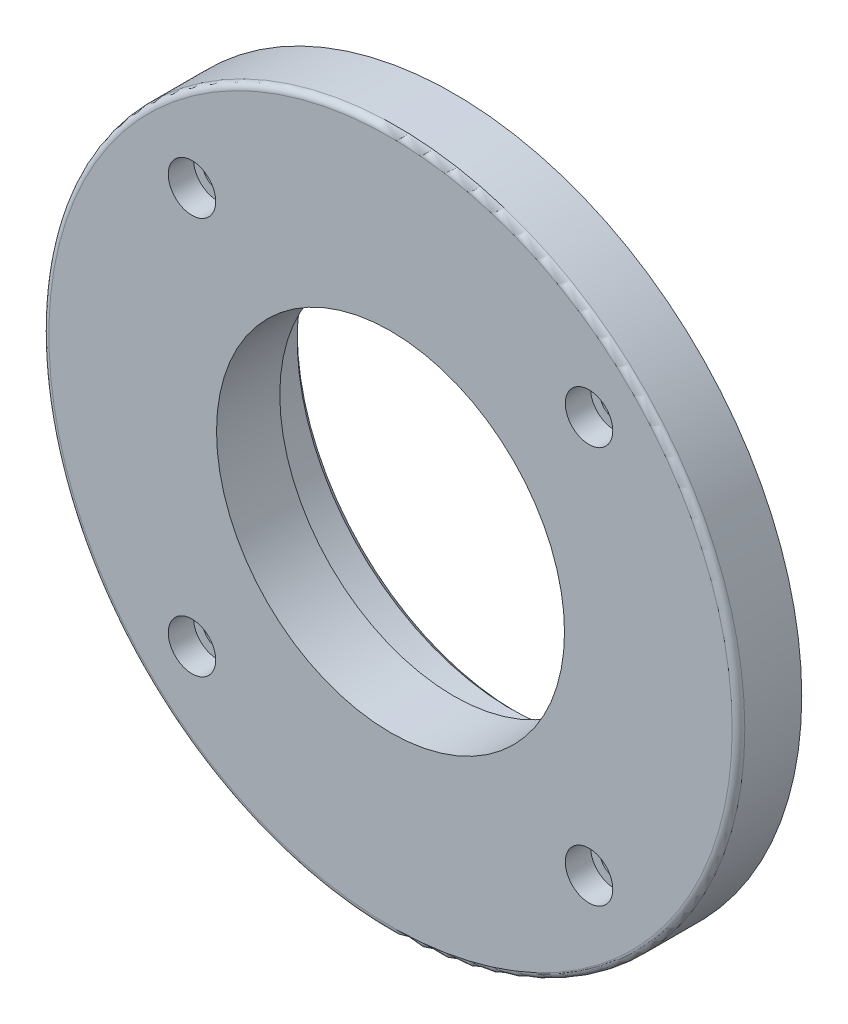
ISO-10303-21;
HEADER;
FILE_DESCRIPTION(('STEP AP214'),'2;1');
FILE_NAME('part.step','',(''),(''),'','','');
FILE_SCHEMA(('AUTOMOTIVE_DESIGN { 1 0 10303 214 1 1 1 1 }'));
ENDSEC;
DATA;
#1=APPLICATION_CONTEXT('core data for automotive mechanical design processes');
#2=APPLICATION_PROTOCOL_DEFINITION('international standard','automotive_design',2000,#1);
#3=PRODUCT_CONTEXT('',#1,'mechanical');
#4=PRODUCT('Part','Part','',(#3));
#5=PRODUCT_RELATED_PRODUCT_CATEGORY('part','',(#4));
#6=PRODUCT_DEFINITION_FORMATION('','',#4);
#7=PRODUCT_DEFINITION_CONTEXT('part definition',#1,'design');
#8=PRODUCT_DEFINITION('design','',#6,#7);
#9=PRODUCT_DEFINITION_SHAPE('','',#8);
#10=(LENGTH_UNIT() NAMED_UNIT(*) SI_UNIT(.MILLI.,.METRE.));
#11=(NAMED_UNIT(*) PLANE_ANGLE_UNIT() SI_UNIT($,.RADIAN.));
#12=(NAMED_UNIT(*) SI_UNIT($,.STERADIAN.) SOLID_ANGLE_UNIT());
#13=UNCERTAINTY_MEASURE_WITH_UNIT(LENGTH_MEASURE(1.E-05),#10,'distance_accuracy_value','');
#14=(GEOMETRIC_REPRESENTATION_CONTEXT(3) GLOBAL_UNCERTAINTY_ASSIGNED_CONTEXT((#13)) GLOBAL_UNIT_ASSIGNED_CONTEXT((#10,
#11,#12)) REPRESENTATION_CONTEXT('',''));
#15=CARTESIAN_POINT('',(0.,0.,0.));
#16=DIRECTION('',(0.,0.,1.));
#17=DIRECTION('',(1.,0.,0.));
#18=AXIS2_PLACEMENT_3D('',#15,#16,#17);
#19=CARTESIAN_POINT('',(0.,0.,0.));
#20=DIRECTION('',(0.,0.,1.));
#21=DIRECTION('',(1.,0.,0.));
#22=AXIS2_PLACEMENT_3D('',#19,#20,#21);
#23=PLANE('',#22);
#24=CARTESIAN_POINT('',(62.7557268303058,62.7557268303064,0.));
#25=DIRECTION('',(0.,0.,1.));
#26=DIRECTION('',(1.,0.,0.));
#27=AXIS2_PLACEMENT_3D('',#24,#25,#26);
#28=CIRCLE('',#27,4.5);
#29=CARTESIAN_POINT('',(67.2557268303058,62.7557268303064,0.));
#30=VERTEX_POINT('',#29);
#31=EDGE_CURVE('E39',#30,#30,#28,.T.);
#32=ORIENTED_EDGE('',*,*,#31,.T.);
#33=EDGE_LOOP('',(#32));
#34=FACE_BOUND('',#33,.T.);
#35=CARTESIAN_POINT('',(62.7557268303058,-62.7557268303064,0.));
#36=DIRECTION('',(0.,0.,1.));
#37=DIRECTION('',(1.,0.,0.));
#38=AXIS2_PLACEMENT_3D('',#35,#36,#37);
#39=CIRCLE('',#38,4.5);
#40=CARTESIAN_POINT('',(67.2557268303058,-62.7557268303064,0.));
#41=VERTEX_POINT('',#40);
#42=EDGE_CURVE('E61',#41,#41,#39,.T.);
#43=ORIENTED_EDGE('',*,*,#42,.T.);
#44=EDGE_LOOP('',(#43));
#45=FACE_BOUND('',#44,.T.);
#46=CARTESIAN_POINT('',(-62.7557268303062,-62.755726830306,0.));
#47=DIRECTION('',(0.,0.,1.));
#48=DIRECTION('',(1.,0.,0.));
#49=AXIS2_PLACEMENT_3D('',#46,#47,#48);
#50=CIRCLE('',#49,4.5);
#51=CARTESIAN_POINT('',(-58.2557268303062,-62.755726830306,0.));
#52=VERTEX_POINT('',#51);
#53=EDGE_CURVE('E57',#52,#52,#50,.T.);
#54=ORIENTED_EDGE('',*,*,#53,.T.);
#55=EDGE_LOOP('',(#54));
#56=FACE_BOUND('',#55,.T.);
#57=CARTESIAN_POINT('',(-62.7557268303058,62.7557268303064,0.));
#58=DIRECTION('',(0.,0.,1.));
#59=DIRECTION('',(1.,0.,0.));
#60=AXIS2_PLACEMENT_3D('',#57,#58,#59);
#61=CIRCLE('',#60,4.5);
#62=CARTESIAN_POINT('',(-58.2557268303058,62.7557268303064,0.));
#63=VERTEX_POINT('',#62);
#64=EDGE_CURVE('E52',#63,#63,#61,.T.);
#65=ORIENTED_EDGE('',*,*,#64,.T.);
#66=EDGE_LOOP('',(#65));
#67=FACE_BOUND('',#66,.T.);
#68=CARTESIAN_POINT('',(0.,0.,0.));
#69=DIRECTION('',(0.,0.,1.));
#70=DIRECTION('',(1.,0.,0.));
#71=AXIS2_PLACEMENT_3D('',#68,#69,#70);
#72=CIRCLE('',#71,110.);
#73=CARTESIAN_POINT('',(110.,0.,0.));
#74=VERTEX_POINT('',#73);
#75=EDGE_CURVE('E97',#74,#74,#72,.T.);
#76=ORIENTED_EDGE('',*,*,#75,.F.);
#77=EDGE_LOOP('',(#76));
#78=FACE_BOUND('',#77,.T.);
#79=CARTESIAN_POINT('',(0.,0.,0.));
#80=DIRECTION('',(0.,0.,1.));
#81=DIRECTION('',(1.,0.,0.));
#82=AXIS2_PLACEMENT_3D('',#79,#80,#81);
#83=CIRCLE('',#82,78.75);
#84=CARTESIAN_POINT('',(78.75,0.,0.));
#85=VERTEX_POINT('',#84);
#86=EDGE_CURVE('E105',#85,#85,#83,.F.);
#87=ORIENTED_EDGE('',*,*,#86,.F.);
#88=EDGE_LOOP('',(#87));
#89=FACE_BOUND('',#88,.T.);
#90=ADVANCED_FACE('F35',(#34,#45,#56,#67,#78,#89),#23,.F.);
#91=CARTESIAN_POINT('',(0.,0.,0.));
#92=DIRECTION('',(0.,0.,1.));
#93=DIRECTION('',(1.,0.,0.));
#94=AXIS2_PLACEMENT_3D('',#91,#92,#93);
#95=CIRCLE('',#94,55.);
#96=CARTESIAN_POINT('',(55.,0.,0.));
#97=VERTEX_POINT('',#96);
#98=EDGE_CURVE('E93',#97,#97,#95,.T.);
#99=ORIENTED_EDGE('',*,*,#98,.T.);
#100=EDGE_LOOP('',(#99));
#101=FACE_BOUND('',#100,.T.);
#102=CARTESIAN_POINT('',(0.,0.,0.));
#103=DIRECTION('',(0.,0.,1.));
#104=DIRECTION('',(1.,0.,0.));
#105=AXIS2_PLACEMENT_3D('',#102,#103,#104);
#106=CIRCLE('',#105,67.5);
#107=CARTESIAN_POINT('',(67.5,0.,0.));
#108=VERTEX_POINT('',#107);
#109=EDGE_CURVE('E102',#108,#108,#106,.T.);
#110=ORIENTED_EDGE('',*,*,#109,.F.);
#111=EDGE_LOOP('',(#110));
#112=FACE_BOUND('',#111,.T.);
#113=ADVANCED_FACE('F125',(#101,#112),#23,.F.);
#114=CARTESIAN_POINT('',(0.,0.,20.));
#115=DIRECTION('',(0.,0.,1.));
#116=DIRECTION('',(1.,0.,0.));
#117=AXIS2_PLACEMENT_3D('',#114,#115,#116);
#118=PLANE('',#117);
#119=CARTESIAN_POINT('',(62.7557268303058,62.7557268303064,20.));
#120=DIRECTION('',(0.,0.,1.));
#121=DIRECTION('',(1.,0.,0.));
#122=AXIS2_PLACEMENT_3D('',#119,#120,#121);
#123=CIRCLE('',#122,7.49999999999999);
#124=CARTESIAN_POINT('',(70.2557268303058,62.7557268303064,20.));
#125=VERTEX_POINT('',#124);
#126=EDGE_CURVE('E331',#125,#125,#123,.T.);
#127=ORIENTED_EDGE('',*,*,#126,.F.);
#128=EDGE_LOOP('',(#127));
#129=FACE_BOUND('',#128,.T.);
#130=CARTESIAN_POINT('',(62.7557268303058,-62.7557268303064,20.));
#131=DIRECTION('',(0.,0.,1.));
#132=DIRECTION('',(1.,0.,0.));
#133=AXIS2_PLACEMENT_3D('',#130,#131,#132);
#134=CIRCLE('',#133,7.49999999999999);
#135=CARTESIAN_POINT('',(70.2557268303058,-62.7557268303064,20.));
#136=VERTEX_POINT('',#135);
#137=EDGE_CURVE('E76',#136,#136,#134,.T.);
#138=ORIENTED_EDGE('',*,*,#137,.F.);
#139=EDGE_LOOP('',(#138));
#140=FACE_BOUND('',#139,.T.);
#141=CARTESIAN_POINT('',(-62.7557268303062,-62.755726830306,20.));
#142=DIRECTION('',(0.,0.,1.));
#143=DIRECTION('',(1.,0.,0.));
#144=AXIS2_PLACEMENT_3D('',#141,#142,#143);
#145=CIRCLE('',#144,7.49999999999999);
#146=CARTESIAN_POINT('',(-55.2557268303062,-62.755726830306,20.));
#147=VERTEX_POINT('',#146);
#148=EDGE_CURVE('E63',#147,#147,#145,.T.);
#149=ORIENTED_EDGE('',*,*,#148,.F.);
#150=EDGE_LOOP('',(#149));
#151=FACE_BOUND('',#150,.T.);
#152=CARTESIAN_POINT('',(-62.7557268303058,62.7557268303064,20.));
#153=DIRECTION('',(0.,0.,1.));
#154=DIRECTION('',(1.,0.,0.));
#155=AXIS2_PLACEMENT_3D('',#152,#153,#154);
#156=CIRCLE('',#155,7.49999999999999);
#157=CARTESIAN_POINT('',(-55.2557268303058,62.7557268303064,20.));
#158=VERTEX_POINT('',#157);
#159=EDGE_CURVE('E59',#158,#158,#156,.T.);
#160=ORIENTED_EDGE('',*,*,#159,.F.);
#161=EDGE_LOOP('',(#160));
#162=FACE_BOUND('',#161,.T.);
#163=CARTESIAN_POINT('',(0.,0.,20.));
#164=DIRECTION('',(0.,0.,1.));
#165=DIRECTION('',(1.,0.,0.));
#166=AXIS2_PLACEMENT_3D('',#163,#164,#165);
#167=CIRCLE('',#166,108.);
#168=CARTESIAN_POINT('',(108.,0.,20.));
#169=VERTEX_POINT('',#168);
#170=EDGE_CURVE('E108',#169,#169,#167,.T.);
#171=ORIENTED_EDGE('',*,*,#170,.T.);
#172=EDGE_LOOP('',(#171));
#173=FACE_BOUND('',#172,.T.);
#174=CARTESIAN_POINT('',(0.,0.,20.));
#175=DIRECTION('',(0.,0.,1.));
#176=DIRECTION('',(1.,0.,0.));
#177=AXIS2_PLACEMENT_3D('',#174,#175,#176);
#178=CIRCLE('',#177,55.);
#179=CARTESIAN_POINT('',(55.,0.,20.));
#180=VERTEX_POINT('',#179);
#181=EDGE_CURVE('E94',#180,#180,#178,.T.);
#182=ORIENTED_EDGE('',*,*,#181,.F.);
#183=EDGE_LOOP('',(#182));
#184=FACE_BOUND('',#183,.T.);
#185=ADVANCED_FACE('F122',(#129,#140,#151,#162,#173,#184),#118,.T.);
#186=CARTESIAN_POINT('',(0.,0.,20.));
#187=DIRECTION('',(0.,0.,-1.));
#188=DIRECTION('',(-1.,0.,0.));
#189=AXIS2_PLACEMENT_3D('',#186,#187,#188);
#190=CYLINDRICAL_SURFACE('',#189,110.);
#191=CARTESIAN_POINT('',(0.,0.,18.));
#192=DIRECTION('',(0.,0.,1.));
#193=DIRECTION('',(1.,0.,0.));
#194=AXIS2_PLACEMENT_3D('',#191,#192,#193);
#195=CIRCLE('',#194,110.);
#196=CARTESIAN_POINT('',(110.,0.,18.));
#197=VERTEX_POINT('',#196);
#198=EDGE_CURVE('E48',#197,#197,#195,.F.);
#199=ORIENTED_EDGE('',*,*,#198,.T.);
#200=EDGE_LOOP('',(#199));
#201=FACE_BOUND('',#200,.T.);
#202=ORIENTED_EDGE('',*,*,#75,.T.);
#203=EDGE_LOOP('',(#202));
#204=FACE_BOUND('',#203,.T.);
#205=ADVANCED_FACE('F113',(#201,#204),#190,.T.);
#206=CARTESIAN_POINT('',(0.,0.,20.));
#207=DIRECTION('',(0.,0.,-1.));
#208=DIRECTION('',(-1.,0.,0.));
#209=AXIS2_PLACEMENT_3D('',#206,#207,#208);
#210=CYLINDRICAL_SURFACE('',#209,55.);
#211=ORIENTED_EDGE('',*,*,#181,.T.);
#212=EDGE_LOOP('',(#211));
#213=FACE_BOUND('',#212,.T.);
#214=ORIENTED_EDGE('',*,*,#98,.F.);
#215=EDGE_LOOP('',(#214));
#216=FACE_BOUND('',#215,.T.);
#217=ADVANCED_FACE('F130',(#213,#216),#210,.F.);
#218=CARTESIAN_POINT('',(0.,0.,0.));
#219=DIRECTION('',(0.,0.,1.));
#220=DIRECTION('',(1.,0.,0.));
#221=AXIS2_PLACEMENT_3D('',#218,#219,#220);
#222=CYLINDRICAL_SURFACE('',#221,78.75);
#223=ORIENTED_EDGE('',*,*,#86,.T.);
#224=EDGE_LOOP('',(#223));
#225=FACE_BOUND('',#224,.T.);
#226=CARTESIAN_POINT('',(0.,0.,-20.));
#227=DIRECTION('',(0.,0.,1.));
#228=DIRECTION('',(1.,0.,0.));
#229=AXIS2_PLACEMENT_3D('',#226,#227,#228);
#230=CIRCLE('',#229,78.75);
#231=CARTESIAN_POINT('',(78.75,0.,-20.));
#232=VERTEX_POINT('',#231);
#233=EDGE_CURVE('E55',#232,#232,#230,.T.);
#234=ORIENTED_EDGE('',*,*,#233,.T.);
#235=EDGE_LOOP('',(#234));
#236=FACE_BOUND('',#235,.T.);
#237=ADVANCED_FACE('F133',(#225,#236),#222,.T.);
#238=CARTESIAN_POINT('',(0.,78.75,-20.));
#239=DIRECTION('',(0.,0.,1.));
#240=DIRECTION('',(1.,0.,0.));
#241=AXIS2_PLACEMENT_3D('',#238,#239,#240);
#242=PLANE('',#241);
#243=CARTESIAN_POINT('',(0.,0.,-20.));
#244=DIRECTION('',(0.,0.,1.));
#245=DIRECTION('',(1.,0.,0.));
#246=AXIS2_PLACEMENT_3D('',#243,#244,#245);
#247=CIRCLE('',#246,69.5);
#248=CARTESIAN_POINT('',(69.5,0.,-20.));
#249=VERTEX_POINT('',#248);
#250=EDGE_CURVE('E43',#249,#249,#247,.T.);
#251=ORIENTED_EDGE('',*,*,#250,.T.);
#252=EDGE_LOOP('',(#251));
#253=FACE_BOUND('',#252,.T.);
#254=ORIENTED_EDGE('',*,*,#233,.F.);
#255=EDGE_LOOP('',(#254));
#256=FACE_BOUND('',#255,.T.);
#257=ADVANCED_FACE('F143',(#253,#256),#242,.F.);
#258=CARTESIAN_POINT('',(0.,0.,0.));
#259=DIRECTION('',(0.,0.,1.));
#260=DIRECTION('',(1.,0.,0.));
#261=AXIS2_PLACEMENT_3D('',#258,#259,#260);
#262=CYLINDRICAL_SURFACE('',#261,67.5);
#263=CARTESIAN_POINT('',(0.,0.,-18.));
#264=DIRECTION('',(0.,0.,1.));
#265=DIRECTION('',(1.,0.,0.));
#266=AXIS2_PLACEMENT_3D('',#263,#264,#265);
#267=CIRCLE('',#266,67.5);
#268=CARTESIAN_POINT('',(67.5,0.,-18.));
#269=VERTEX_POINT('',#268);
#270=EDGE_CURVE('E10',#269,#269,#267,.F.);
#271=ORIENTED_EDGE('',*,*,#270,.T.);
#272=EDGE_LOOP('',(#271));
#273=FACE_BOUND('',#272,.T.);
#274=ORIENTED_EDGE('',*,*,#109,.T.);
#275=EDGE_LOOP('',(#274));
#276=FACE_BOUND('',#275,.T.);
#277=ADVANCED_FACE('F119',(#273,#276),#262,.F.);
#278=CARTESIAN_POINT('',(0.,0.,18.));
#279=DIRECTION('',(0.,0.,1.));
#280=DIRECTION('',(1.,0.,0.));
#281=AXIS2_PLACEMENT_3D('',#278,#279,#280);
#282=TOROIDAL_SURFACE('',#281,108.,2.);
#283=ORIENTED_EDGE('',*,*,#198,.F.);
#284=EDGE_LOOP('',(#283));
#285=FACE_BOUND('',#284,.T.);
#286=ORIENTED_EDGE('',*,*,#170,.F.);
#287=EDGE_LOOP('',(#286));
#288=FACE_BOUND('',#287,.T.);
#289=ADVANCED_FACE('F116',(#285,#288),#282,.T.);
#290=CARTESIAN_POINT('',(0.,0.,-20.));
#291=DIRECTION('',(0.,0.,-1.));
#292=DIRECTION('',(-1.,0.,0.));
#293=AXIS2_PLACEMENT_3D('',#290,#291,#292);
#294=CONICAL_SURFACE('',#293,69.5,0.785398163397448);
#295=ORIENTED_EDGE('',*,*,#270,.F.);
#296=EDGE_LOOP('',(#295));
#297=FACE_BOUND('',#296,.T.);
#298=ORIENTED_EDGE('',*,*,#250,.F.);
#299=EDGE_LOOP('',(#298));
#300=FACE_BOUND('',#299,.T.);
#301=ADVANCED_FACE('F37',(#297,#300),#294,.F.);
#302=CARTESIAN_POINT('',(-62.7557268303058,62.7557268303064,20.));
#303=DIRECTION('',(0.,0.,1.));
#304=DIRECTION('',(1.,0.,0.));
#305=AXIS2_PLACEMENT_3D('',#302,#303,#304);
#306=CYLINDRICAL_SURFACE('',#305,4.5);
#307=CARTESIAN_POINT('',(-62.7557268303058,62.7557268303064,12.));
#308=DIRECTION('',(0.,0.,1.));
#309=DIRECTION('',(1.,0.,0.));
#310=AXIS2_PLACEMENT_3D('',#307,#308,#309);
#311=CIRCLE('',#310,4.5);
#312=CARTESIAN_POINT('',(-58.2557268303058,62.7557268303064,12.));
#313=VERTEX_POINT('',#312);
#314=EDGE_CURVE('E56',#313,#313,#311,.T.);
#315=ORIENTED_EDGE('',*,*,#314,.T.);
#316=EDGE_LOOP('',(#315));
#317=FACE_BOUND('',#316,.T.);
#318=ORIENTED_EDGE('',*,*,#64,.F.);
#319=EDGE_LOOP('',(#318));
#320=FACE_BOUND('',#319,.T.);
#321=ADVANCED_FACE('F195',(#317,#320),#306,.F.);
#322=CARTESIAN_POINT('',(-58.2557268303058,62.7557268303064,12.));
#323=DIRECTION('',(0.,0.,-1.));
#324=DIRECTION('',(-1.,0.,0.));
#325=AXIS2_PLACEMENT_3D('',#322,#323,#324);
#326=PLANE('',#325);
#327=ORIENTED_EDGE('',*,*,#314,.F.);
#328=EDGE_LOOP('',(#327));
#329=FACE_BOUND('',#328,.T.);
#330=CARTESIAN_POINT('',(-62.7557268303058,62.7557268303064,12.));
#331=DIRECTION('',(0.,0.,1.));
#332=DIRECTION('',(1.,0.,0.));
#333=AXIS2_PLACEMENT_3D('',#330,#331,#332);
#334=CIRCLE('',#333,7.5);
#335=CARTESIAN_POINT('',(-55.2557268303058,62.7557268303064,12.));
#336=VERTEX_POINT('',#335);
#337=EDGE_CURVE('E86',#336,#336,#334,.T.);
#338=ORIENTED_EDGE('',*,*,#337,.T.);
#339=EDGE_LOOP('',(#338));
#340=FACE_BOUND('',#339,.T.);
#341=ADVANCED_FACE('F204',(#329,#340),#326,.F.);
#342=CARTESIAN_POINT('',(-62.7557268303058,62.7557268303064,20.));
#343=DIRECTION('',(0.,0.,1.));
#344=DIRECTION('',(1.,0.,0.));
#345=AXIS2_PLACEMENT_3D('',#342,#343,#344);
#346=CYLINDRICAL_SURFACE('',#345,7.5);
#347=ORIENTED_EDGE('',*,*,#337,.F.);
#348=EDGE_LOOP('',(#347));
#349=FACE_BOUND('',#348,.T.);
#350=ORIENTED_EDGE('',*,*,#159,.T.);
#351=EDGE_LOOP('',(#350));
#352=FACE_BOUND('',#351,.T.);
#353=ADVANCED_FACE('F213',(#349,#352),#346,.F.);
#354=CARTESIAN_POINT('',(-62.7557268303062,-62.755726830306,20.));
#355=DIRECTION('',(0.,0.,1.));
#356=DIRECTION('',(1.,0.,0.));
#357=AXIS2_PLACEMENT_3D('',#354,#355,#356);
#358=CYLINDRICAL_SURFACE('',#357,4.5);
#359=CARTESIAN_POINT('',(-62.7557268303062,-62.755726830306,12.));
#360=DIRECTION('',(0.,0.,1.));
#361=DIRECTION('',(1.,0.,0.));
#362=AXIS2_PLACEMENT_3D('',#359,#360,#361);
#363=CIRCLE('',#362,4.5);
#364=CARTESIAN_POINT('',(-58.2557268303062,-62.755726830306,12.));
#365=VERTEX_POINT('',#364);
#366=EDGE_CURVE('E60',#365,#365,#363,.T.);
#367=ORIENTED_EDGE('',*,*,#366,.T.);
#368=EDGE_LOOP('',(#367));
#369=FACE_BOUND('',#368,.T.);
#370=ORIENTED_EDGE('',*,*,#53,.F.);
#371=EDGE_LOOP('',(#370));
#372=FACE_BOUND('',#371,.T.);
#373=ADVANCED_FACE('F222',(#369,#372),#358,.F.);
#374=CARTESIAN_POINT('',(-58.2557268303062,-62.755726830306,12.));
#375=DIRECTION('',(0.,0.,-1.));
#376=DIRECTION('',(-1.,0.,0.));
#377=AXIS2_PLACEMENT_3D('',#374,#375,#376);
#378=PLANE('',#377);
#379=ORIENTED_EDGE('',*,*,#366,.F.);
#380=EDGE_LOOP('',(#379));
#381=FACE_BOUND('',#380,.T.);
#382=CARTESIAN_POINT('',(-62.7557268303062,-62.755726830306,12.));
#383=DIRECTION('',(0.,0.,1.));
#384=DIRECTION('',(1.,0.,0.));
#385=AXIS2_PLACEMENT_3D('',#382,#383,#384);
#386=CIRCLE('',#385,7.5);
#387=CARTESIAN_POINT('',(-55.2557268303062,-62.755726830306,12.));
#388=VERTEX_POINT('',#387);
#389=EDGE_CURVE('E68',#388,#388,#386,.T.);
#390=ORIENTED_EDGE('',*,*,#389,.T.);
#391=EDGE_LOOP('',(#390));
#392=FACE_BOUND('',#391,.T.);
#393=ADVANCED_FACE('F242',(#381,#392),#378,.F.);
#394=CARTESIAN_POINT('',(-62.7557268303062,-62.755726830306,20.));
#395=DIRECTION('',(0.,0.,1.));
#396=DIRECTION('',(1.,0.,0.));
#397=AXIS2_PLACEMENT_3D('',#394,#395,#396);
#398=CYLINDRICAL_SURFACE('',#397,7.5);
#399=ORIENTED_EDGE('',*,*,#389,.F.);
#400=EDGE_LOOP('',(#399));
#401=FACE_BOUND('',#400,.T.);
#402=ORIENTED_EDGE('',*,*,#148,.T.);
#403=EDGE_LOOP('',(#402));
#404=FACE_BOUND('',#403,.T.);
#405=ADVANCED_FACE('F252',(#401,#404),#398,.F.);
#406=CARTESIAN_POINT('',(62.7557268303058,-62.7557268303064,20.));
#407=DIRECTION('',(0.,0.,1.));
#408=DIRECTION('',(1.,0.,0.));
#409=AXIS2_PLACEMENT_3D('',#406,#407,#408);
#410=CYLINDRICAL_SURFACE('',#409,4.5);
#411=CARTESIAN_POINT('',(62.7557268303058,-62.7557268303064,12.));
#412=DIRECTION('',(0.,0.,1.));
#413=DIRECTION('',(1.,0.,0.));
#414=AXIS2_PLACEMENT_3D('',#411,#412,#413);
#415=CIRCLE('',#414,4.5);
#416=CARTESIAN_POINT('',(67.2557268303058,-62.7557268303064,12.));
#417=VERTEX_POINT('',#416);
#418=EDGE_CURVE('E64',#417,#417,#415,.T.);
#419=ORIENTED_EDGE('',*,*,#418,.T.);
#420=EDGE_LOOP('',(#419));
#421=FACE_BOUND('',#420,.T.);
#422=ORIENTED_EDGE('',*,*,#42,.F.);
#423=EDGE_LOOP('',(#422));
#424=FACE_BOUND('',#423,.T.);
#425=ADVANCED_FACE('F262',(#421,#424),#410,.F.);
#426=CARTESIAN_POINT('',(67.2557268303058,-62.7557268303064,12.));
#427=DIRECTION('',(0.,0.,-1.));
#428=DIRECTION('',(-1.,0.,0.));
#429=AXIS2_PLACEMENT_3D('',#426,#427,#428);
#430=PLANE('',#429);
#431=ORIENTED_EDGE('',*,*,#418,.F.);
#432=EDGE_LOOP('',(#431));
#433=FACE_BOUND('',#432,.T.);
#434=CARTESIAN_POINT('',(62.7557268303058,-62.7557268303064,12.));
#435=DIRECTION('',(0.,0.,1.));
#436=DIRECTION('',(1.,0.,0.));
#437=AXIS2_PLACEMENT_3D('',#434,#435,#436);
#438=CIRCLE('',#437,7.49999999999999);
#439=CARTESIAN_POINT('',(70.2557268303058,-62.7557268303064,12.));
#440=VERTEX_POINT('',#439);
#441=EDGE_CURVE('E71',#440,#440,#438,.T.);
#442=ORIENTED_EDGE('',*,*,#441,.T.);
#443=EDGE_LOOP('',(#442));
#444=FACE_BOUND('',#443,.T.);
#445=ADVANCED_FACE('F272',(#433,#444),#430,.F.);
#446=CARTESIAN_POINT('',(62.7557268303058,-62.7557268303064,20.));
#447=DIRECTION('',(0.,0.,1.));
#448=DIRECTION('',(1.,0.,0.));
#449=AXIS2_PLACEMENT_3D('',#446,#447,#448);
#450=CYLINDRICAL_SURFACE('',#449,7.49999999999999);
#451=ORIENTED_EDGE('',*,*,#441,.F.);
#452=EDGE_LOOP('',(#451));
#453=FACE_BOUND('',#452,.T.);
#454=ORIENTED_EDGE('',*,*,#137,.T.);
#455=EDGE_LOOP('',(#454));
#456=FACE_BOUND('',#455,.T.);
#457=ADVANCED_FACE('F281',(#453,#456),#450,.F.);
#458=CARTESIAN_POINT('',(62.7557268303058,62.7557268303064,20.));
#459=DIRECTION('',(0.,0.,1.));
#460=DIRECTION('',(1.,0.,0.));
#461=AXIS2_PLACEMENT_3D('',#458,#459,#460);
#462=CYLINDRICAL_SURFACE('',#461,4.5);
#463=CARTESIAN_POINT('',(62.7557268303058,62.7557268303064,12.));
#464=DIRECTION('',(0.,0.,1.));
#465=DIRECTION('',(1.,0.,0.));
#466=AXIS2_PLACEMENT_3D('',#463,#464,#465);
#467=CIRCLE('',#466,4.5);
#468=CARTESIAN_POINT('',(67.2557268303058,62.7557268303064,12.));
#469=VERTEX_POINT('',#468);
#470=EDGE_CURVE('E333',#469,#469,#467,.T.);
#471=ORIENTED_EDGE('',*,*,#470,.T.);
#472=EDGE_LOOP('',(#471));
#473=FACE_BOUND('',#472,.T.);
#474=ORIENTED_EDGE('',*,*,#31,.F.);
#475=EDGE_LOOP('',(#474));
#476=FACE_BOUND('',#475,.T.);
#477=ADVANCED_FACE('F291',(#473,#476),#462,.F.);
#478=CARTESIAN_POINT('',(67.2557268303058,62.7557268303064,12.));
#479=DIRECTION('',(0.,0.,-1.));
#480=DIRECTION('',(-1.,0.,0.));
#481=AXIS2_PLACEMENT_3D('',#478,#479,#480);
#482=PLANE('',#481);
#483=ORIENTED_EDGE('',*,*,#470,.F.);
#484=EDGE_LOOP('',(#483));
#485=FACE_BOUND('',#484,.T.);
#486=CARTESIAN_POINT('',(62.7557268303058,62.7557268303064,12.));
#487=DIRECTION('',(0.,0.,1.));
#488=DIRECTION('',(1.,0.,0.));
#489=AXIS2_PLACEMENT_3D('',#486,#487,#488);
#490=CIRCLE('',#489,7.49999999999999);
#491=CARTESIAN_POINT('',(70.2557268303058,62.7557268303064,12.));
#492=VERTEX_POINT('',#491);
#493=EDGE_CURVE('E328',#492,#492,#490,.T.);
#494=ORIENTED_EDGE('',*,*,#493,.T.);
#495=EDGE_LOOP('',(#494));
#496=FACE_BOUND('',#495,.T.);
#497=ADVANCED_FACE('F301',(#485,#496),#482,.F.);
#498=CARTESIAN_POINT('',(62.7557268303058,62.7557268303064,20.));
#499=DIRECTION('',(0.,0.,1.));
#500=DIRECTION('',(1.,0.,0.));
#501=AXIS2_PLACEMENT_3D('',#498,#499,#500);
#502=CYLINDRICAL_SURFACE('',#501,7.49999999999999);
#503=ORIENTED_EDGE('',*,*,#493,.F.);
#504=EDGE_LOOP('',(#503));
#505=FACE_BOUND('',#504,.T.);
#506=ORIENTED_EDGE('',*,*,#126,.T.);
#507=EDGE_LOOP('',(#506));
#508=FACE_BOUND('',#507,.T.);
#509=ADVANCED_FACE('F311',(#505,#508),#502,.F.);
#510=CLOSED_SHELL('',(#90,#113,#185,#205,#217,#237,#257,#277,#289,#301,#321,#341,#353,#373,#393,
#405,#425,#445,#457,#477,#497,#509));
#511=MANIFOLD_SOLID_BREP('B2',#510);
#512=ADVANCED_BREP_SHAPE_REPRESENTATION('',(#18,#511),#14);
#513=SHAPE_DEFINITION_REPRESENTATION(#9,#512);
ENDSEC;
END-ISO-10303-21;
